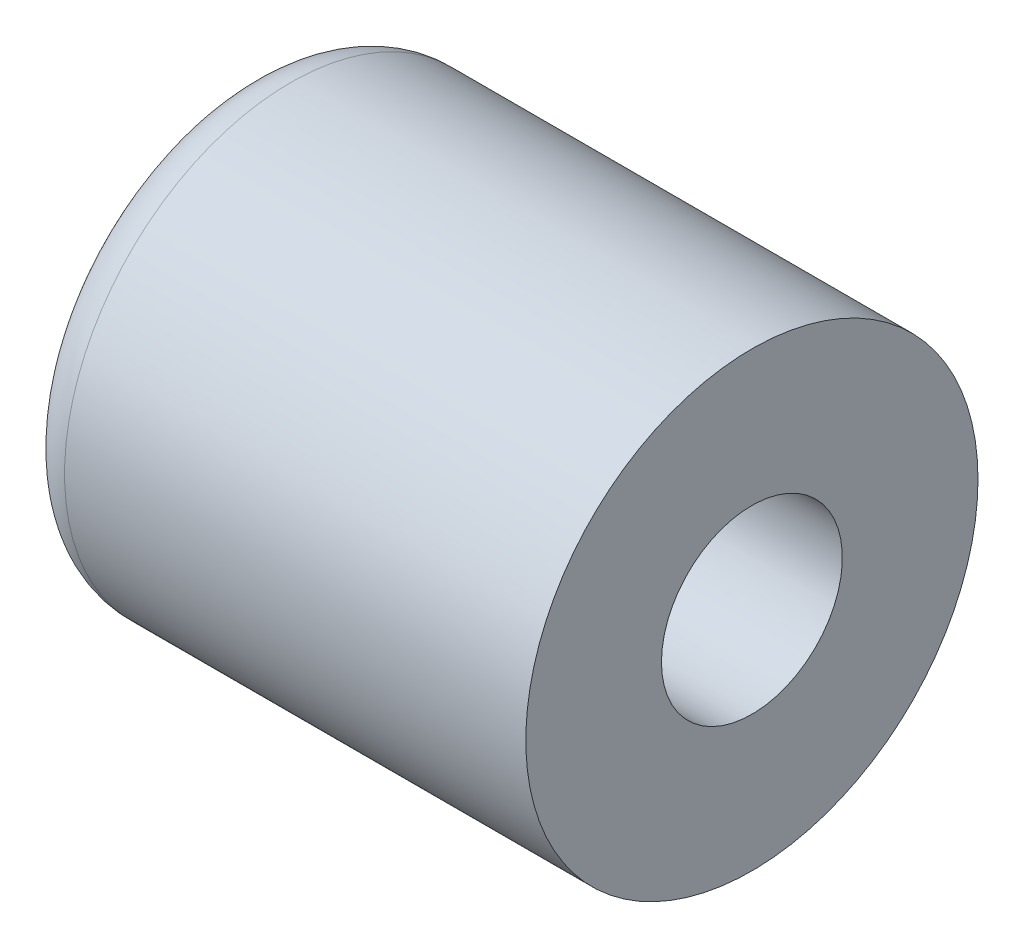
ISO-10303-21;
HEADER;
FILE_DESCRIPTION(('STEP AP214'),'2;1');
FILE_NAME('part.step','',(''),(''),'','','');
FILE_SCHEMA(('AUTOMOTIVE_DESIGN { 1 0 10303 214 1 1 1 1 }'));
ENDSEC;
DATA;
#1=APPLICATION_CONTEXT('core data for automotive mechanical design processes');
#2=APPLICATION_PROTOCOL_DEFINITION('international standard','automotive_design',2000,#1);
#3=PRODUCT_CONTEXT('',#1,'mechanical');
#4=PRODUCT('Part','Part','',(#3));
#5=PRODUCT_RELATED_PRODUCT_CATEGORY('part','',(#4));
#6=PRODUCT_DEFINITION_FORMATION('','',#4);
#7=PRODUCT_DEFINITION_CONTEXT('part definition',#1,'design');
#8=PRODUCT_DEFINITION('design','',#6,#7);
#9=PRODUCT_DEFINITION_SHAPE('','',#8);
#10=(LENGTH_UNIT() NAMED_UNIT(*) SI_UNIT(.MILLI.,.METRE.));
#11=(NAMED_UNIT(*) PLANE_ANGLE_UNIT() SI_UNIT($,.RADIAN.));
#12=(NAMED_UNIT(*) SI_UNIT($,.STERADIAN.) SOLID_ANGLE_UNIT());
#13=UNCERTAINTY_MEASURE_WITH_UNIT(LENGTH_MEASURE(1.E-05),#10,'distance_accuracy_value','');
#14=(GEOMETRIC_REPRESENTATION_CONTEXT(3) GLOBAL_UNCERTAINTY_ASSIGNED_CONTEXT((#13)) GLOBAL_UNIT_ASSIGNED_CONTEXT((#10,
#11,#12)) REPRESENTATION_CONTEXT('',''));
#15=CARTESIAN_POINT('',(0.,0.,0.));
#16=DIRECTION('',(0.,0.,1.));
#17=DIRECTION('',(1.,0.,0.));
#18=AXIS2_PLACEMENT_3D('',#15,#16,#17);
#19=CARTESIAN_POINT('',(-0.200000000000001,0.,0.));
#20=DIRECTION('',(-1.,0.,0.));
#21=DIRECTION('',(0.,0.,1.));
#22=AXIS2_PLACEMENT_3D('',#19,#20,#21);
#23=PLANE('',#22);
#24=CARTESIAN_POINT('',(-0.200000000000001,0.,0.));
#25=DIRECTION('',(-1.,0.,0.));
#26=DIRECTION('',(0.,0.,1.));
#27=AXIS2_PLACEMENT_3D('',#24,#25,#26);
#28=CIRCLE('',#27,1.);
#29=CARTESIAN_POINT('',(-0.200000000000001,0.,1.));
#30=VERTEX_POINT('',#29);
#31=EDGE_CURVE('E18',#30,#30,#28,.F.);
#32=ORIENTED_EDGE('',*,*,#31,.T.);
#33=EDGE_LOOP('',(#32));
#34=FACE_BOUND('',#33,.T.);
#35=ADVANCED_FACE('F15',(#34),#23,.F.);
#36=CARTESIAN_POINT('',(2.8,0.,0.));
#37=DIRECTION('',(-1.,0.,0.));
#38=DIRECTION('',(0.,0.,1.));
#39=AXIS2_PLACEMENT_3D('',#36,#37,#38);
#40=CYLINDRICAL_SURFACE('',#39,1.);
#41=CARTESIAN_POINT('',(2.8,0.,0.));
#42=DIRECTION('',(-1.,0.,0.));
#43=DIRECTION('',(0.,0.,1.));
#44=AXIS2_PLACEMENT_3D('',#41,#42,#43);
#45=CIRCLE('',#44,1.);
#46=CARTESIAN_POINT('',(2.8,0.,1.));
#47=VERTEX_POINT('',#46);
#48=EDGE_CURVE('E56',#47,#47,#45,.F.);
#49=ORIENTED_EDGE('',*,*,#48,.T.);
#50=EDGE_LOOP('',(#49));
#51=FACE_BOUND('',#50,.T.);
#52=ORIENTED_EDGE('',*,*,#31,.F.);
#53=EDGE_LOOP('',(#52));
#54=FACE_BOUND('',#53,.T.);
#55=ADVANCED_FACE('F64',(#51,#54),#40,.F.);
#56=CARTESIAN_POINT('',(-2.8,0.,0.));
#57=DIRECTION('',(-1.,0.,0.));
#58=DIRECTION('',(0.,0.,1.));
#59=AXIS2_PLACEMENT_3D('',#56,#57,#58);
#60=PLANE('',#59);
#61=CARTESIAN_POINT('',(-2.8,0.,0.));
#62=DIRECTION('',(1.,0.,0.));
#63=DIRECTION('',(0.,1.,0.));
#64=AXIS2_PLACEMENT_3D('',#61,#62,#63);
#65=CIRCLE('',#64,2.);
#66=CARTESIAN_POINT('',(-2.8,2.,0.));
#67=VERTEX_POINT('',#66);
#68=EDGE_CURVE('E27',#67,#67,#65,.T.);
#69=ORIENTED_EDGE('',*,*,#68,.F.);
#70=EDGE_LOOP('',(#69));
#71=FACE_BOUND('',#70,.T.);
#72=ADVANCED_FACE('F66',(#71),#60,.T.);
#73=CARTESIAN_POINT('',(2.8,0.,0.));
#74=DIRECTION('',(-1.,0.,0.));
#75=DIRECTION('',(0.,0.,1.));
#76=AXIS2_PLACEMENT_3D('',#73,#74,#75);
#77=PLANE('',#76);
#78=ORIENTED_EDGE('',*,*,#48,.F.);
#79=EDGE_LOOP('',(#78));
#80=FACE_BOUND('',#79,.T.);
#81=CARTESIAN_POINT('',(2.8,0.,0.));
#82=DIRECTION('',(1.,0.,0.));
#83=DIRECTION('',(0.,0.,-1.));
#84=AXIS2_PLACEMENT_3D('',#81,#82,#83);
#85=CIRCLE('',#84,2.5);
#86=CARTESIAN_POINT('',(2.8,0.,-2.5));
#87=VERTEX_POINT('',#86);
#88=EDGE_CURVE('E22',#87,#87,#85,.F.);
#89=ORIENTED_EDGE('',*,*,#88,.F.);
#90=EDGE_LOOP('',(#89));
#91=FACE_BOUND('',#90,.T.);
#92=ADVANCED_FACE('F43',(#80,#91),#77,.F.);
#93=CARTESIAN_POINT('',(-2.3,0.,0.));
#94=DIRECTION('',(1.,0.,0.));
#95=DIRECTION('',(0.,0.,-1.));
#96=AXIS2_PLACEMENT_3D('',#93,#94,#95);
#97=TOROIDAL_SURFACE('',#96,2.,0.5);
#98=CARTESIAN_POINT('',(-2.3,0.,0.));
#99=DIRECTION('',(1.,0.,0.));
#100=DIRECTION('',(0.,0.,-1.));
#101=AXIS2_PLACEMENT_3D('',#98,#99,#100);
#102=CIRCLE('',#101,2.5);
#103=CARTESIAN_POINT('',(-2.3,0.,-2.5));
#104=VERTEX_POINT('',#103);
#105=EDGE_CURVE('E10',#104,#104,#102,.T.);
#106=ORIENTED_EDGE('',*,*,#105,.F.);
#107=EDGE_LOOP('',(#106));
#108=FACE_BOUND('',#107,.T.);
#109=ORIENTED_EDGE('',*,*,#68,.T.);
#110=EDGE_LOOP('',(#109));
#111=FACE_BOUND('',#110,.T.);
#112=ADVANCED_FACE('F37',(#108,#111),#97,.T.);
#113=CARTESIAN_POINT('',(0.,0.,0.));
#114=DIRECTION('',(1.,0.,0.));
#115=DIRECTION('',(0.,0.,-1.));
#116=AXIS2_PLACEMENT_3D('',#113,#114,#115);
#117=CYLINDRICAL_SURFACE('',#116,2.5);
#118=ORIENTED_EDGE('',*,*,#105,.T.);
#119=EDGE_LOOP('',(#118));
#120=FACE_BOUND('',#119,.T.);
#121=ORIENTED_EDGE('',*,*,#88,.T.);
#122=EDGE_LOOP('',(#121));
#123=FACE_BOUND('',#122,.T.);
#124=ADVANCED_FACE('F42',(#120,#123),#117,.T.);
#125=CLOSED_SHELL('',(#35,#55,#72,#92,#112,#124));
#126=MANIFOLD_SOLID_BREP('B1',#125);
#127=ADVANCED_BREP_SHAPE_REPRESENTATION('',(#18,#126),#14);
#128=SHAPE_DEFINITION_REPRESENTATION(#9,#127);
ENDSEC;
END-ISO-10303-21;
